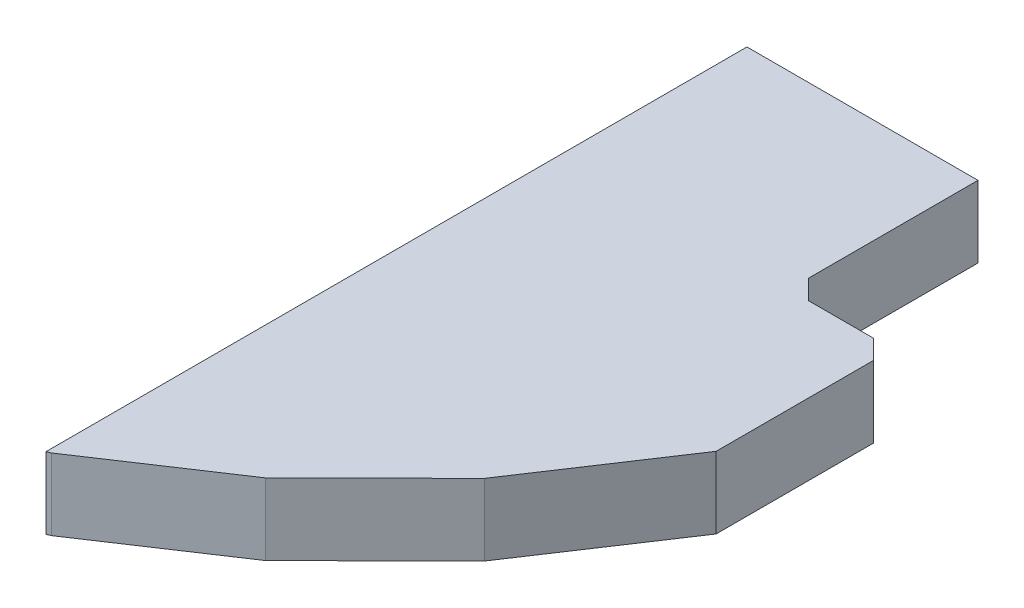
ISO-10303-21;
HEADER;
FILE_DESCRIPTION(('STEP AP214'),'2;1');
FILE_NAME('part.step','',(''),(''),'','','');
FILE_SCHEMA(('AUTOMOTIVE_DESIGN { 1 0 10303 214 1 1 1 1 }'));
ENDSEC;
DATA;
#1=APPLICATION_CONTEXT('core data for automotive mechanical design processes');
#2=APPLICATION_PROTOCOL_DEFINITION('international standard','automotive_design',2000,#1);
#3=PRODUCT_CONTEXT('',#1,'mechanical');
#4=PRODUCT('Part','Part','',(#3));
#5=PRODUCT_RELATED_PRODUCT_CATEGORY('part','',(#4));
#6=PRODUCT_DEFINITION_FORMATION('','',#4);
#7=PRODUCT_DEFINITION_CONTEXT('part definition',#1,'design');
#8=PRODUCT_DEFINITION('design','',#6,#7);
#9=PRODUCT_DEFINITION_SHAPE('','',#8);
#10=(LENGTH_UNIT() NAMED_UNIT(*) SI_UNIT(.MILLI.,.METRE.));
#11=(NAMED_UNIT(*) PLANE_ANGLE_UNIT() SI_UNIT($,.RADIAN.));
#12=(NAMED_UNIT(*) SI_UNIT($,.STERADIAN.) SOLID_ANGLE_UNIT());
#13=UNCERTAINTY_MEASURE_WITH_UNIT(LENGTH_MEASURE(1.E-05),#10,'distance_accuracy_value','');
#14=(GEOMETRIC_REPRESENTATION_CONTEXT(3) GLOBAL_UNCERTAINTY_ASSIGNED_CONTEXT((#13)) GLOBAL_UNIT_ASSIGNED_CONTEXT((#10,
#11,#12)) REPRESENTATION_CONTEXT('',''));
#15=CARTESIAN_POINT('',(0.,0.,0.));
#16=DIRECTION('',(0.,0.,1.));
#17=DIRECTION('',(1.,0.,0.));
#18=AXIS2_PLACEMENT_3D('',#15,#16,#17);
#19=CARTESIAN_POINT('',(0.,7.409200066,0.));
#20=DIRECTION('',(1.,0.,0.));
#21=DIRECTION('',(0.,0.,-1.));
#22=AXIS2_PLACEMENT_3D('',#19,#20,#21);
#23=PLANE('',#22);
#24=DIRECTION('',(0.,0.,1.));
#25=VECTOR('',#24,1.);
#26=CARTESIAN_POINT('',(0.,0.,0.));
#27=LINE('',#26,#25);
#28=CARTESIAN_POINT('',(0.,0.,0.));
#29=VERTEX_POINT('',#28);
#30=CARTESIAN_POINT('',(0.,0.,72.5161101227286));
#31=VERTEX_POINT('',#30);
#32=EDGE_CURVE('E158',#29,#31,#27,.T.);
#33=ORIENTED_EDGE('',*,*,#32,.T.);
#34=DIRECTION('',(0.,-1.,0.));
#35=VECTOR('',#34,1.);
#36=CARTESIAN_POINT('',(0.,7.409200066,72.5161101227286));
#37=LINE('',#36,#35);
#38=CARTESIAN_POINT('',(0.,7.409200066,72.5161101227286));
#39=VERTEX_POINT('',#38);
#40=EDGE_CURVE('E11',#39,#31,#37,.T.);
#41=ORIENTED_EDGE('',*,*,#40,.F.);
#42=DIRECTION('',(0.,0.,1.));
#43=VECTOR('',#42,1.);
#44=CARTESIAN_POINT('',(0.,7.409200066,0.));
#45=LINE('',#44,#43);
#46=CARTESIAN_POINT('',(0.,7.409200066,0.));
#47=VERTEX_POINT('',#46);
#48=EDGE_CURVE('E189',#47,#39,#45,.T.);
#49=ORIENTED_EDGE('',*,*,#48,.F.);
#50=DIRECTION('',(0.,-1.,0.));
#51=VECTOR('',#50,1.);
#52=CARTESIAN_POINT('',(0.,7.409200066,0.));
#53=LINE('',#52,#51);
#54=EDGE_CURVE('E154',#47,#29,#53,.T.);
#55=ORIENTED_EDGE('',*,*,#54,.T.);
#56=EDGE_LOOP('',(#33,#41,#49,#55));
#57=FACE_BOUND('',#56,.T.);
#58=ADVANCED_FACE('F39',(#57),#23,.F.);
#59=CARTESIAN_POINT('',(0.,7.409200066,72.5161101227286));
#60=DIRECTION('',(-0.380988906601606,0.,-0.924579608820416));
#61=DIRECTION('',(-0.924579608820416,0.,0.380988906601606));
#62=AXIS2_PLACEMENT_3D('',#59,#60,#61);
#63=PLANE('',#62);
#64=DIRECTION('',(0.924579608820416,0.,-0.380988906601606));
#65=VECTOR('',#64,1.);
#66=CARTESIAN_POINT('',(0.,0.,72.5161101227286));
#67=LINE('',#66,#65);
#68=CARTESIAN_POINT('',(0.388693134345051,0.,72.3559424412819));
#69=VERTEX_POINT('',#68);
#70=EDGE_CURVE('E162',#31,#69,#67,.T.);
#71=ORIENTED_EDGE('',*,*,#70,.T.);
#72=DIRECTION('',(0.,-1.,0.));
#73=VECTOR('',#72,1.);
#74=CARTESIAN_POINT('',(0.388693134345051,7.409200066,72.3559424412819));
#75=LINE('',#74,#73);
#76=CARTESIAN_POINT('',(0.388693134345051,7.409200066,72.3559424412819));
#77=VERTEX_POINT('',#76);
#78=EDGE_CURVE('E48',#77,#69,#75,.T.);
#79=ORIENTED_EDGE('',*,*,#78,.F.);
#80=DIRECTION('',(0.924579608820416,0.,-0.380988906601606));
#81=VECTOR('',#80,1.);
#82=CARTESIAN_POINT('',(0.,7.409200066,72.5161101227286));
#83=LINE('',#82,#81);
#84=EDGE_CURVE('E108',#39,#77,#83,.T.);
#85=ORIENTED_EDGE('',*,*,#84,.F.);
#86=ORIENTED_EDGE('',*,*,#40,.T.);
#87=EDGE_LOOP('',(#71,#79,#85,#86));
#88=FACE_BOUND('',#87,.T.);
#89=ADVANCED_FACE('F275',(#88),#63,.F.);
#90=CARTESIAN_POINT('',(13.7166031868352,7.409200066,63.5034392002358));
#91=DIRECTION('',(-0.553281452565381,0.,-0.832994378280635));
#92=DIRECTION('',(-0.832994378280635,0.,0.553281452565381));
#93=AXIS2_PLACEMENT_3D('',#90,#91,#92);
#94=PLANE('',#93);
#95=DIRECTION('',(0.832994378280635,0.,-0.553281452565381));
#96=VECTOR('',#95,1.);
#97=CARTESIAN_POINT('',(13.7166031868352,0.,63.5034392002358));
#98=LINE('',#97,#96);
#99=CARTESIAN_POINT('',(13.7166031868352,0.,63.5034392002358));
#100=VERTEX_POINT('',#99);
#101=EDGE_CURVE('E165',#69,#100,#98,.T.);
#102=ORIENTED_EDGE('',*,*,#101,.T.);
#103=DIRECTION('',(0.,-1.,0.));
#104=VECTOR('',#103,1.);
#105=CARTESIAN_POINT('',(13.7166031868352,7.409200066,63.5034392002358));
#106=LINE('',#105,#104);
#107=CARTESIAN_POINT('',(13.7166031868352,7.409200066,63.5034392002358));
#108=VERTEX_POINT('',#107);
#109=EDGE_CURVE('E212',#108,#100,#106,.T.);
#110=ORIENTED_EDGE('',*,*,#109,.F.);
#111=DIRECTION('',(0.832994378280635,0.,-0.553281452565381));
#112=VECTOR('',#111,1.);
#113=CARTESIAN_POINT('',(13.7166031868352,7.409200066,63.5034392002358));
#114=LINE('',#113,#112);
#115=EDGE_CURVE('E222',#77,#108,#114,.T.);
#116=ORIENTED_EDGE('',*,*,#115,.F.);
#117=ORIENTED_EDGE('',*,*,#78,.T.);
#118=EDGE_LOOP('',(#102,#110,#116,#117));
#119=FACE_BOUND('',#118,.T.);
#120=ADVANCED_FACE('F220',(#119),#94,.F.);
#121=CARTESIAN_POINT('',(25.0717216843239,7.409200066,52.2312928248559));
#122=DIRECTION('',(-0.704509148461244,0.,-0.709694906093043));
#123=DIRECTION('',(-0.709694906093043,0.,0.704509148461244));
#124=AXIS2_PLACEMENT_3D('',#121,#122,#123);
#125=PLANE('',#124);
#126=DIRECTION('',(0.709694906093043,0.,-0.704509148461244));
#127=VECTOR('',#126,1.);
#128=CARTESIAN_POINT('',(25.0717216843239,0.,52.2312928248559));
#129=LINE('',#128,#127);
#130=CARTESIAN_POINT('',(25.0717216843239,0.,52.2312928248559));
#131=VERTEX_POINT('',#130);
#132=EDGE_CURVE('E168',#100,#131,#129,.T.);
#133=ORIENTED_EDGE('',*,*,#132,.T.);
#134=DIRECTION('',(0.,-1.,0.));
#135=VECTOR('',#134,1.);
#136=CARTESIAN_POINT('',(25.0717216843239,7.409200066,52.2312928248559));
#137=LINE('',#136,#135);
#138=CARTESIAN_POINT('',(25.0717216843239,7.409200066,52.2312928248559));
#139=VERTEX_POINT('',#138);
#140=EDGE_CURVE('E208',#139,#131,#137,.T.);
#141=ORIENTED_EDGE('',*,*,#140,.F.);
#142=DIRECTION('',(0.709694906093043,0.,-0.704509148461244));
#143=VECTOR('',#142,1.);
#144=CARTESIAN_POINT('',(25.0717216843239,7.409200066,52.2312928248559));
#145=LINE('',#144,#143);
#146=EDGE_CURVE('E241',#108,#139,#145,.T.);
#147=ORIENTED_EDGE('',*,*,#146,.F.);
#148=ORIENTED_EDGE('',*,*,#109,.T.);
#149=EDGE_LOOP('',(#133,#141,#147,#148));
#150=FACE_BOUND('',#149,.T.);
#151=ADVANCED_FACE('F231',(#150),#125,.F.);
#152=CARTESIAN_POINT('',(34.63,7.409200066,37.8227751821807));
#153=DIRECTION('',(-0.83331337978492,0.,-0.552800878320063));
#154=DIRECTION('',(-0.552800878320063,0.,0.83331337978492));
#155=AXIS2_PLACEMENT_3D('',#152,#153,#154);
#156=PLANE('',#155);
#157=DIRECTION('',(0.552800878320063,0.,-0.83331337978492));
#158=VECTOR('',#157,1.);
#159=CARTESIAN_POINT('',(34.63,0.,37.8227751821807));
#160=LINE('',#159,#158);
#161=CARTESIAN_POINT('',(34.63,0.,37.8227751821807));
#162=VERTEX_POINT('',#161);
#163=EDGE_CURVE('E171',#131,#162,#160,.T.);
#164=ORIENTED_EDGE('',*,*,#163,.T.);
#165=DIRECTION('',(0.,-1.,0.));
#166=VECTOR('',#165,1.);
#167=CARTESIAN_POINT('',(34.63,7.409200066,37.8227751821807));
#168=LINE('',#167,#166);
#169=CARTESIAN_POINT('',(34.63,7.409200066,37.8227751821807));
#170=VERTEX_POINT('',#169);
#171=EDGE_CURVE('E204',#170,#162,#168,.T.);
#172=ORIENTED_EDGE('',*,*,#171,.F.);
#173=DIRECTION('',(0.552800878320063,0.,-0.83331337978492));
#174=VECTOR('',#173,1.);
#175=CARTESIAN_POINT('',(34.63,7.409200066,37.8227751821807));
#176=LINE('',#175,#174);
#177=EDGE_CURVE('E237',#139,#170,#176,.T.);
#178=ORIENTED_EDGE('',*,*,#177,.F.);
#179=ORIENTED_EDGE('',*,*,#140,.T.);
#180=EDGE_LOOP('',(#164,#172,#178,#179));
#181=FACE_BOUND('',#180,.T.);
#182=ADVANCED_FACE('F235',(#181),#156,.F.);
#183=CARTESIAN_POINT('',(34.63,7.409200066,21.55));
#184=DIRECTION('',(-1.,0.,0.));
#185=DIRECTION('',(0.,0.,1.));
#186=AXIS2_PLACEMENT_3D('',#183,#184,#185);
#187=PLANE('',#186);
#188=DIRECTION('',(0.,0.,-1.));
#189=VECTOR('',#188,1.);
#190=CARTESIAN_POINT('',(34.63,0.,21.55));
#191=LINE('',#190,#189);
#192=CARTESIAN_POINT('',(34.63,0.,21.55));
#193=VERTEX_POINT('',#192);
#194=EDGE_CURVE('E174',#162,#193,#191,.T.);
#195=ORIENTED_EDGE('',*,*,#194,.T.);
#196=DIRECTION('',(0.,-1.,0.));
#197=VECTOR('',#196,1.);
#198=CARTESIAN_POINT('',(34.63,7.409200066,21.55));
#199=LINE('',#198,#197);
#200=CARTESIAN_POINT('',(34.63,7.409200066,21.55));
#201=VERTEX_POINT('',#200);
#202=EDGE_CURVE('E200',#201,#193,#199,.T.);
#203=ORIENTED_EDGE('',*,*,#202,.F.);
#204=DIRECTION('',(0.,0.,-1.));
#205=VECTOR('',#204,1.);
#206=CARTESIAN_POINT('',(34.63,7.409200066,21.55));
#207=LINE('',#206,#205);
#208=EDGE_CURVE('E240',#170,#201,#207,.T.);
#209=ORIENTED_EDGE('',*,*,#208,.F.);
#210=ORIENTED_EDGE('',*,*,#171,.T.);
#211=EDGE_LOOP('',(#195,#203,#209,#210));
#212=FACE_BOUND('',#211,.T.);
#213=ADVANCED_FACE('F288',(#212),#187,.F.);
#214=CARTESIAN_POINT('',(32.63,7.409200066,19.55));
#215=DIRECTION('',(-0.707106781186548,0.,0.707106781186548));
#216=DIRECTION('',(0.707106781186548,0.,0.707106781186548));
#217=AXIS2_PLACEMENT_3D('',#214,#215,#216);
#218=PLANE('',#217);
#219=DIRECTION('',(-0.707106781186547,0.,-0.707106781186547));
#220=VECTOR('',#219,1.);
#221=CARTESIAN_POINT('',(32.63,0.,19.55));
#222=LINE('',#221,#220);
#223=CARTESIAN_POINT('',(32.63,0.,19.55));
#224=VERTEX_POINT('',#223);
#225=EDGE_CURVE('E177',#193,#224,#222,.T.);
#226=ORIENTED_EDGE('',*,*,#225,.T.);
#227=DIRECTION('',(0.,-1.,0.));
#228=VECTOR('',#227,1.);
#229=CARTESIAN_POINT('',(32.63,7.409200066,19.55));
#230=LINE('',#229,#228);
#231=CARTESIAN_POINT('',(32.63,7.409200066,19.55));
#232=VERTEX_POINT('',#231);
#233=EDGE_CURVE('E196',#232,#224,#230,.T.);
#234=ORIENTED_EDGE('',*,*,#233,.F.);
#235=DIRECTION('',(-0.707106781186547,0.,-0.707106781186547));
#236=VECTOR('',#235,1.);
#237=CARTESIAN_POINT('',(32.63,7.409200066,19.55));
#238=LINE('',#237,#236);
#239=EDGE_CURVE('E245',#201,#232,#238,.T.);
#240=ORIENTED_EDGE('',*,*,#239,.F.);
#241=ORIENTED_EDGE('',*,*,#202,.T.);
#242=EDGE_LOOP('',(#226,#234,#240,#241));
#243=FACE_BOUND('',#242,.T.);
#244=ADVANCED_FACE('F256',(#243),#218,.F.);
#245=CARTESIAN_POINT('',(25.9,7.409200066,19.55));
#246=DIRECTION('',(0.,0.,1.));
#247=DIRECTION('',(1.,0.,0.));
#248=AXIS2_PLACEMENT_3D('',#245,#246,#247);
#249=PLANE('',#248);
#250=DIRECTION('',(-1.,0.,0.));
#251=VECTOR('',#250,1.);
#252=CARTESIAN_POINT('',(25.9,0.,19.55));
#253=LINE('',#252,#251);
#254=CARTESIAN_POINT('',(25.9,0.,19.55));
#255=VERTEX_POINT('',#254);
#256=EDGE_CURVE('E180',#224,#255,#253,.T.);
#257=ORIENTED_EDGE('',*,*,#256,.T.);
#258=DIRECTION('',(0.,-1.,0.));
#259=VECTOR('',#258,1.);
#260=CARTESIAN_POINT('',(25.9,7.409200066,19.55));
#261=LINE('',#260,#259);
#262=CARTESIAN_POINT('',(25.9,7.409200066,19.55));
#263=VERTEX_POINT('',#262);
#264=EDGE_CURVE('E147',#263,#255,#261,.T.);
#265=ORIENTED_EDGE('',*,*,#264,.F.);
#266=DIRECTION('',(-1.,0.,0.));
#267=VECTOR('',#266,1.);
#268=CARTESIAN_POINT('',(25.9,7.409200066,19.55));
#269=LINE('',#268,#267);
#270=EDGE_CURVE('E136',#232,#263,#269,.T.);
#271=ORIENTED_EDGE('',*,*,#270,.F.);
#272=ORIENTED_EDGE('',*,*,#233,.T.);
#273=EDGE_LOOP('',(#257,#265,#271,#272));
#274=FACE_BOUND('',#273,.T.);
#275=ADVANCED_FACE('F260',(#274),#249,.F.);
#276=CARTESIAN_POINT('',(23.9,7.409200066,17.55));
#277=DIRECTION('',(-0.707106781186547,0.,0.707106781186548));
#278=DIRECTION('',(0.707106781186548,0.,0.707106781186547));
#279=AXIS2_PLACEMENT_3D('',#276,#277,#278);
#280=PLANE('',#279);
#281=DIRECTION('',(-0.707106781186548,0.,-0.707106781186547));
#282=VECTOR('',#281,1.);
#283=CARTESIAN_POINT('',(23.9,0.,17.55));
#284=LINE('',#283,#282);
#285=CARTESIAN_POINT('',(23.9,0.,17.55));
#286=VERTEX_POINT('',#285);
#287=EDGE_CURVE('E145',#255,#286,#284,.T.);
#288=ORIENTED_EDGE('',*,*,#287,.T.);
#289=DIRECTION('',(0.,-1.,0.));
#290=VECTOR('',#289,1.);
#291=CARTESIAN_POINT('',(23.9,7.409200066,17.55));
#292=LINE('',#291,#290);
#293=CARTESIAN_POINT('',(23.9,7.409200066,17.55));
#294=VERTEX_POINT('',#293);
#295=EDGE_CURVE('E142',#294,#286,#292,.T.);
#296=ORIENTED_EDGE('',*,*,#295,.F.);
#297=DIRECTION('',(-0.707106781186548,0.,-0.707106781186547));
#298=VECTOR('',#297,1.);
#299=CARTESIAN_POINT('',(23.9,7.409200066,17.55));
#300=LINE('',#299,#298);
#301=EDGE_CURVE('E130',#263,#294,#300,.T.);
#302=ORIENTED_EDGE('',*,*,#301,.F.);
#303=ORIENTED_EDGE('',*,*,#264,.T.);
#304=EDGE_LOOP('',(#288,#296,#302,#303));
#305=FACE_BOUND('',#304,.T.);
#306=ADVANCED_FACE('F143',(#305),#280,.F.);
#307=CARTESIAN_POINT('',(23.9,7.409200066,0.));
#308=DIRECTION('',(-1.,0.,0.));
#309=DIRECTION('',(0.,0.,1.));
#310=AXIS2_PLACEMENT_3D('',#307,#308,#309);
#311=PLANE('',#310);
#312=DIRECTION('',(0.,0.,-1.));
#313=VECTOR('',#312,1.);
#314=CARTESIAN_POINT('',(23.9,0.,0.));
#315=LINE('',#314,#313);
#316=CARTESIAN_POINT('',(23.9,0.,0.));
#317=VERTEX_POINT('',#316);
#318=EDGE_CURVE('E94',#286,#317,#315,.T.);
#319=ORIENTED_EDGE('',*,*,#318,.T.);
#320=DIRECTION('',(0.,-1.,0.));
#321=VECTOR('',#320,1.);
#322=CARTESIAN_POINT('',(23.9,7.409200066,0.));
#323=LINE('',#322,#321);
#324=CARTESIAN_POINT('',(23.9,7.409200066,0.));
#325=VERTEX_POINT('',#324);
#326=EDGE_CURVE('E148',#325,#317,#323,.T.);
#327=ORIENTED_EDGE('',*,*,#326,.F.);
#328=DIRECTION('',(0.,0.,-1.));
#329=VECTOR('',#328,1.);
#330=CARTESIAN_POINT('',(23.9,7.409200066,0.));
#331=LINE('',#330,#329);
#332=EDGE_CURVE('E134',#294,#325,#331,.T.);
#333=ORIENTED_EDGE('',*,*,#332,.F.);
#334=ORIENTED_EDGE('',*,*,#295,.T.);
#335=EDGE_LOOP('',(#319,#327,#333,#334));
#336=FACE_BOUND('',#335,.T.);
#337=ADVANCED_FACE('F150',(#336),#311,.F.);
#338=CARTESIAN_POINT('',(0.,7.409200066,0.));
#339=DIRECTION('',(0.,0.,1.));
#340=DIRECTION('',(1.,0.,0.));
#341=AXIS2_PLACEMENT_3D('',#338,#339,#340);
#342=PLANE('',#341);
#343=DIRECTION('',(-1.,0.,0.));
#344=VECTOR('',#343,1.);
#345=CARTESIAN_POINT('',(0.,0.,0.));
#346=LINE('',#345,#344);
#347=EDGE_CURVE('E100',#317,#29,#346,.T.);
#348=ORIENTED_EDGE('',*,*,#347,.T.);
#349=ORIENTED_EDGE('',*,*,#54,.F.);
#350=DIRECTION('',(-1.,0.,0.));
#351=VECTOR('',#350,1.);
#352=CARTESIAN_POINT('',(0.,7.409200066,0.));
#353=LINE('',#352,#351);
#354=EDGE_CURVE('E56',#325,#47,#353,.T.);
#355=ORIENTED_EDGE('',*,*,#354,.F.);
#356=ORIENTED_EDGE('',*,*,#326,.T.);
#357=EDGE_LOOP('',(#348,#349,#355,#356));
#358=FACE_BOUND('',#357,.T.);
#359=ADVANCED_FACE('F264',(#358),#342,.F.);
#360=CARTESIAN_POINT('',(0.,7.409200066,0.));
#361=DIRECTION('',(0.,1.,0.));
#362=DIRECTION('',(0.,0.,1.));
#363=AXIS2_PLACEMENT_3D('',#360,#361,#362);
#364=PLANE('',#363);
#365=ORIENTED_EDGE('',*,*,#48,.T.);
#366=ORIENTED_EDGE('',*,*,#84,.T.);
#367=ORIENTED_EDGE('',*,*,#115,.T.);
#368=ORIENTED_EDGE('',*,*,#146,.T.);
#369=ORIENTED_EDGE('',*,*,#177,.T.);
#370=ORIENTED_EDGE('',*,*,#208,.T.);
#371=ORIENTED_EDGE('',*,*,#239,.T.);
#372=ORIENTED_EDGE('',*,*,#270,.T.);
#373=ORIENTED_EDGE('',*,*,#301,.T.);
#374=ORIENTED_EDGE('',*,*,#332,.T.);
#375=ORIENTED_EDGE('',*,*,#354,.T.);
#376=EDGE_LOOP('',(#365,#366,#367,#368,#369,#370,#371,#372,#373,#374,#375));
#377=FACE_BOUND('',#376,.T.);
#378=ADVANCED_FACE('F132',(#377),#364,.T.);
#379=CARTESIAN_POINT('',(0.,0.,0.));
#380=DIRECTION('',(0.,1.,0.));
#381=DIRECTION('',(0.,0.,1.));
#382=AXIS2_PLACEMENT_3D('',#379,#380,#381);
#383=PLANE('',#382);
#384=ORIENTED_EDGE('',*,*,#32,.F.);
#385=ORIENTED_EDGE('',*,*,#347,.F.);
#386=ORIENTED_EDGE('',*,*,#318,.F.);
#387=ORIENTED_EDGE('',*,*,#287,.F.);
#388=ORIENTED_EDGE('',*,*,#256,.F.);
#389=ORIENTED_EDGE('',*,*,#225,.F.);
#390=ORIENTED_EDGE('',*,*,#194,.F.);
#391=ORIENTED_EDGE('',*,*,#163,.F.);
#392=ORIENTED_EDGE('',*,*,#132,.F.);
#393=ORIENTED_EDGE('',*,*,#101,.F.);
#394=ORIENTED_EDGE('',*,*,#70,.F.);
#395=EDGE_LOOP('',(#384,#385,#386,#387,#388,#389,#390,#391,#392,#393,#394));
#396=FACE_BOUND('',#395,.T.);
#397=ADVANCED_FACE('F226',(#396),#383,.F.);
#398=CLOSED_SHELL('',(#58,#89,#120,#151,#182,#213,#244,#275,#306,#337,#359,#378,#397));
#399=MANIFOLD_SOLID_BREP('B2',#398);
#400=ADVANCED_BREP_SHAPE_REPRESENTATION('',(#18,#399),#14);
#401=SHAPE_DEFINITION_REPRESENTATION(#9,#400);
ENDSEC;
END-ISO-10303-21;
